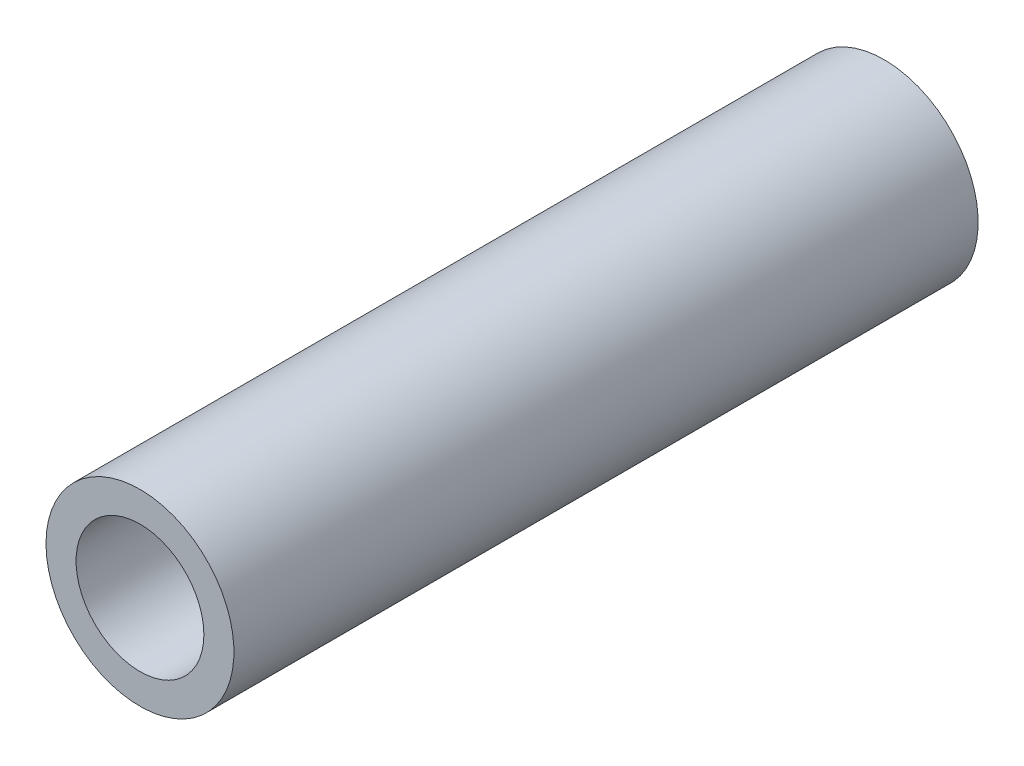
ISO-10303-21;
HEADER;
FILE_DESCRIPTION(('STEP AP214'),'2;1');
FILE_NAME('part.step','',(''),(''),'','','');
FILE_SCHEMA(('AUTOMOTIVE_DESIGN { 1 0 10303 214 1 1 1 1 }'));
ENDSEC;
DATA;
#1=APPLICATION_CONTEXT('core data for automotive mechanical design processes');
#2=APPLICATION_PROTOCOL_DEFINITION('international standard','automotive_design',2000,#1);
#3=PRODUCT_CONTEXT('',#1,'mechanical');
#4=PRODUCT('Part','Part','',(#3));
#5=PRODUCT_RELATED_PRODUCT_CATEGORY('part','',(#4));
#6=PRODUCT_DEFINITION_FORMATION('','',#4);
#7=PRODUCT_DEFINITION_CONTEXT('part definition',#1,'design');
#8=PRODUCT_DEFINITION('design','',#6,#7);
#9=PRODUCT_DEFINITION_SHAPE('','',#8);
#10=(LENGTH_UNIT() NAMED_UNIT(*) SI_UNIT(.MILLI.,.METRE.));
#11=(NAMED_UNIT(*) PLANE_ANGLE_UNIT() SI_UNIT($,.RADIAN.));
#12=(NAMED_UNIT(*) SI_UNIT($,.STERADIAN.) SOLID_ANGLE_UNIT());
#13=UNCERTAINTY_MEASURE_WITH_UNIT(LENGTH_MEASURE(1.E-05),#10,'distance_accuracy_value','');
#14=(GEOMETRIC_REPRESENTATION_CONTEXT(3) GLOBAL_UNCERTAINTY_ASSIGNED_CONTEXT((#13)) GLOBAL_UNIT_ASSIGNED_CONTEXT((#10,
#11,#12)) REPRESENTATION_CONTEXT('',''));
#15=CARTESIAN_POINT('',(0.,0.,0.));
#16=DIRECTION('',(0.,0.,1.));
#17=DIRECTION('',(1.,0.,0.));
#18=AXIS2_PLACEMENT_3D('',#15,#16,#17);
#19=CARTESIAN_POINT('',(0.,0.,19.8));
#20=DIRECTION('',(0.,0.,-1.));
#21=DIRECTION('',(-1.,0.,0.));
#22=AXIS2_PLACEMENT_3D('',#19,#20,#21);
#23=CYLINDRICAL_SURFACE('',#22,2.5);
#24=CARTESIAN_POINT('',(0.,0.,19.8));
#25=DIRECTION('',(0.,0.,1.));
#26=DIRECTION('',(1.,0.,0.));
#27=AXIS2_PLACEMENT_3D('',#24,#25,#26);
#28=CIRCLE('',#27,2.5);
#29=CARTESIAN_POINT('',(-2.5,0.,19.8));
#30=VERTEX_POINT('',#29);
#31=EDGE_CURVE('E10',#30,#30,#28,.T.);
#32=CARTESIAN_POINT('',(0.,0.,0.));
#33=DIRECTION('',(0.,0.,1.));
#34=DIRECTION('',(1.,0.,0.));
#35=AXIS2_PLACEMENT_3D('',#32,#33,#34);
#36=CIRCLE('',#35,2.5);
#37=CARTESIAN_POINT('',(-2.5,0.,0.));
#38=VERTEX_POINT('',#37);
#39=EDGE_CURVE('E52',#38,#38,#36,.T.);
#40=CARTESIAN_POINT('',(-2.5,0.,19.8));
#41=CARTESIAN_POINT('',(-2.5,0.,19.59375));
#42=CARTESIAN_POINT('',(-2.5,0.,19.3875));
#43=CARTESIAN_POINT('',(-2.5,0.,18.975));
#44=CARTESIAN_POINT('',(-2.5,0.,18.76875));
#45=CARTESIAN_POINT('',(-2.5,0.,18.35625));
#46=CARTESIAN_POINT('',(-2.5,0.,18.15));
#47=CARTESIAN_POINT('',(-2.5,0.,17.7375));
#48=CARTESIAN_POINT('',(-2.5,0.,17.53125));
#49=CARTESIAN_POINT('',(-2.5,0.,17.11875));
#50=CARTESIAN_POINT('',(-2.5,0.,16.9125));
#51=CARTESIAN_POINT('',(-2.5,0.,16.5));
#52=CARTESIAN_POINT('',(-2.5,0.,16.29375));
#53=CARTESIAN_POINT('',(-2.5,0.,15.88125));
#54=CARTESIAN_POINT('',(-2.5,0.,15.675));
#55=CARTESIAN_POINT('',(-2.5,0.,15.2625));
#56=CARTESIAN_POINT('',(-2.5,0.,15.05625));
#57=CARTESIAN_POINT('',(-2.5,0.,14.64375));
#58=CARTESIAN_POINT('',(-2.5,0.,14.4375));
#59=CARTESIAN_POINT('',(-2.5,0.,14.025));
#60=CARTESIAN_POINT('',(-2.5,0.,13.81875));
#61=CARTESIAN_POINT('',(-2.5,0.,13.40625));
#62=CARTESIAN_POINT('',(-2.5,0.,13.2));
#63=CARTESIAN_POINT('',(-2.5,0.,12.7875));
#64=CARTESIAN_POINT('',(-2.5,0.,12.58125));
#65=CARTESIAN_POINT('',(-2.5,0.,12.16875));
#66=CARTESIAN_POINT('',(-2.5,0.,11.9625));
#67=CARTESIAN_POINT('',(-2.5,0.,11.55));
#68=CARTESIAN_POINT('',(-2.5,0.,11.34375));
#69=CARTESIAN_POINT('',(-2.5,0.,10.93125));
#70=CARTESIAN_POINT('',(-2.5,0.,10.725));
#71=CARTESIAN_POINT('',(-2.5,0.,10.3125));
#72=CARTESIAN_POINT('',(-2.5,0.,10.10625));
#73=CARTESIAN_POINT('',(-2.5,0.,9.69375));
#74=CARTESIAN_POINT('',(-2.5,0.,9.4875));
#75=CARTESIAN_POINT('',(-2.5,0.,9.075));
#76=CARTESIAN_POINT('',(-2.5,0.,8.86875));
#77=CARTESIAN_POINT('',(-2.5,0.,8.45625));
#78=CARTESIAN_POINT('',(-2.5,0.,8.25));
#79=CARTESIAN_POINT('',(-2.5,0.,7.8375));
#80=CARTESIAN_POINT('',(-2.5,0.,7.63125));
#81=CARTESIAN_POINT('',(-2.5,0.,7.21875));
#82=CARTESIAN_POINT('',(-2.5,0.,7.0125));
#83=CARTESIAN_POINT('',(-2.5,0.,6.6));
#84=CARTESIAN_POINT('',(-2.5,0.,6.39375));
#85=CARTESIAN_POINT('',(-2.5,0.,5.98125));
#86=CARTESIAN_POINT('',(-2.5,0.,5.775));
#87=CARTESIAN_POINT('',(-2.5,0.,5.3625));
#88=CARTESIAN_POINT('',(-2.5,0.,5.15625));
#89=CARTESIAN_POINT('',(-2.5,0.,4.74375));
#90=CARTESIAN_POINT('',(-2.5,0.,4.5375));
#91=CARTESIAN_POINT('',(-2.5,0.,4.125));
#92=CARTESIAN_POINT('',(-2.5,0.,3.91875));
#93=CARTESIAN_POINT('',(-2.5,0.,3.50625));
#94=CARTESIAN_POINT('',(-2.5,0.,3.3));
#95=CARTESIAN_POINT('',(-2.5,0.,2.8875));
#96=CARTESIAN_POINT('',(-2.5,0.,2.68125));
#97=CARTESIAN_POINT('',(-2.5,0.,2.26875));
#98=CARTESIAN_POINT('',(-2.5,0.,2.0625));
#99=CARTESIAN_POINT('',(-2.5,0.,1.65));
#100=CARTESIAN_POINT('',(-2.5,0.,1.44375));
#101=CARTESIAN_POINT('',(-2.5,0.,1.03125));
#102=CARTESIAN_POINT('',(-2.5,0.,0.825));
#103=CARTESIAN_POINT('',(-2.5,0.,0.412500000000001));
#104=CARTESIAN_POINT('',(-2.5,0.,0.206250000000001));
#105=CARTESIAN_POINT('',(-2.5,0.,0.));
#106=B_SPLINE_CURVE_WITH_KNOTS('',3,(#40,#41,#42,#43,#44,#45,#46,#47,#48,#49,#50,#51,#52,#53,
#54,#55,#56,#57,#58,#59,#60,#61,#62,#63,#64,#65,#66,#67,#68,#69,#70,#71,#72,#73,#74,#75,#76,#77,
#78,#79,#80,#81,#82,#83,#84,#85,#86,#87,#88,#89,#90,#91,#92,#93,#94,#95,#96,#97,#98,#99,#100,
#101,#102,#103,#104,#105),.UNSPECIFIED.,.F.,.F.,(4,2,2,2,2,2,2,2,2,2,2,2,2,2,2,2,2,2,2,2,2,2,2,
2,2,2,2,2,2,2,2,2,4),(0.,0.618750000000001,1.2375,1.85625,2.475,3.09375,3.7125,4.33125,4.95,
5.56875,6.1875,6.80625,7.425,8.04375,8.6625,9.28125,9.9,10.51875,11.1375,11.75625,12.375,
12.99375,13.6125,14.23125,14.85,15.46875,16.0875,16.70625,17.325,17.94375,18.5625,19.18125,
19.8),.UNSPECIFIED.);
#107=EDGE_CURVE('BSEAM43',#30,#38,#106,.T.);
#108=ORIENTED_EDGE('',*,*,#31,.F.);
#109=ORIENTED_EDGE('',*,*,#39,.T.);
#110=ORIENTED_EDGE('',*,*,#107,.T.);
#111=ORIENTED_EDGE('',*,*,#107,.F.);
#112=EDGE_LOOP('',(#108,#110,#109,#111));
#113=FACE_BOUND('',#112,.T.);
#114=ADVANCED_FACE('F43',(#113),#23,.T.);
#115=CARTESIAN_POINT('',(0.,0.,19.8));
#116=DIRECTION('',(0.,0.,1.));
#117=DIRECTION('',(1.,0.,0.));
#118=AXIS2_PLACEMENT_3D('',#115,#116,#117);
#119=PLANE('',#118);
#120=CARTESIAN_POINT('',(0.,0.,19.800012));
#121=DIRECTION('',(0.,0.,1.));
#122=DIRECTION('',(1.,0.,0.));
#123=AXIS2_PLACEMENT_3D('',#120,#121,#122);
#124=CIRCLE('',#123,1.7);
#125=CARTESIAN_POINT('',(1.7,0.,19.800012));
#126=VERTEX_POINT('',#125);
#127=EDGE_CURVE('E69',#126,#126,#124,.T.);
#128=ORIENTED_EDGE('',*,*,#127,.F.);
#129=EDGE_LOOP('',(#128));
#130=FACE_BOUND('',#129,.T.);
#131=ORIENTED_EDGE('',*,*,#31,.T.);
#132=EDGE_LOOP('',(#131));
#133=FACE_BOUND('',#132,.T.);
#134=ADVANCED_FACE('F66',(#130,#133),#119,.T.);
#135=CARTESIAN_POINT('',(0.,0.,0.));
#136=DIRECTION('',(0.,0.,1.));
#137=DIRECTION('',(1.,0.,0.));
#138=AXIS2_PLACEMENT_3D('',#135,#136,#137);
#139=PLANE('',#138);
#140=CARTESIAN_POINT('',(0.,0.,0.));
#141=DIRECTION('',(0.,0.,1.));
#142=DIRECTION('',(1.,0.,0.));
#143=AXIS2_PLACEMENT_3D('',#140,#141,#142);
#144=CIRCLE('',#143,1.7);
#145=CARTESIAN_POINT('',(1.7,0.,0.));
#146=VERTEX_POINT('',#145);
#147=EDGE_CURVE('E56',#146,#146,#144,.T.);
#148=ORIENTED_EDGE('',*,*,#147,.T.);
#149=EDGE_LOOP('',(#148));
#150=FACE_BOUND('',#149,.T.);
#151=ORIENTED_EDGE('',*,*,#39,.F.);
#152=EDGE_LOOP('',(#151));
#153=FACE_BOUND('',#152,.T.);
#154=ADVANCED_FACE('F79',(#150,#153),#139,.F.);
#155=CARTESIAN_POINT('',(0.,0.,0.));
#156=DIRECTION('',(0.,0.,1.));
#157=DIRECTION('',(1.,0.,0.));
#158=AXIS2_PLACEMENT_3D('',#155,#156,#157);
#159=CYLINDRICAL_SURFACE('',#158,1.7);
#160=ORIENTED_EDGE('',*,*,#147,.F.);
#161=EDGE_LOOP('',(#160));
#162=FACE_BOUND('',#161,.T.);
#163=ORIENTED_EDGE('',*,*,#127,.T.);
#164=EDGE_LOOP('',(#163));
#165=FACE_BOUND('',#164,.T.);
#166=ADVANCED_FACE('F82',(#162,#165),#159,.F.);
#167=CLOSED_SHELL('',(#114,#134,#154,#166));
#168=MANIFOLD_SOLID_BREP('B2',#167);
#169=ADVANCED_BREP_SHAPE_REPRESENTATION('',(#18,#168),#14);
#170=SHAPE_DEFINITION_REPRESENTATION(#9,#169);
ENDSEC;
END-ISO-10303-21;
